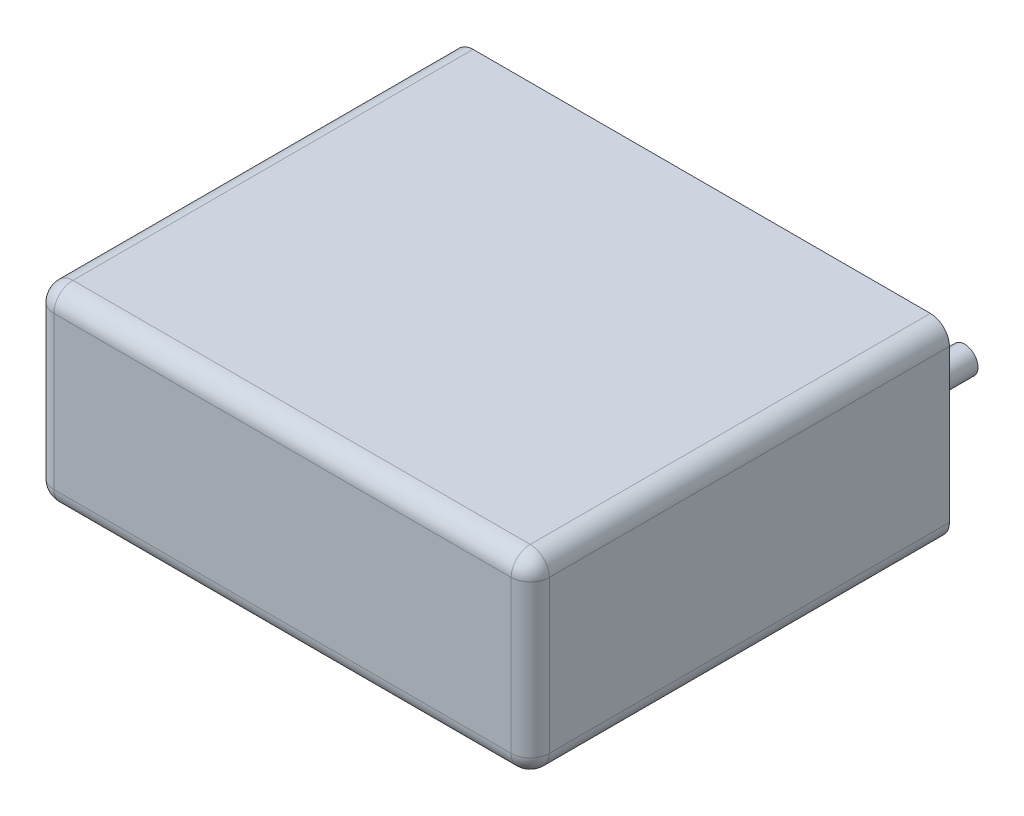
ISO-10303-21;
HEADER;
FILE_DESCRIPTION(('STEP AP214'),'2;1');
FILE_NAME('part.step','',(''),(''),'','','');
FILE_SCHEMA(('AUTOMOTIVE_DESIGN { 1 0 10303 214 1 1 1 1 }'));
ENDSEC;
DATA;
#1=APPLICATION_CONTEXT('core data for automotive mechanical design processes');
#2=APPLICATION_PROTOCOL_DEFINITION('international standard','automotive_design',2000,#1);
#3=PRODUCT_CONTEXT('',#1,'mechanical');
#4=PRODUCT('Part','Part','',(#3));
#5=PRODUCT_RELATED_PRODUCT_CATEGORY('part','',(#4));
#6=PRODUCT_DEFINITION_FORMATION('','',#4);
#7=PRODUCT_DEFINITION_CONTEXT('part definition',#1,'design');
#8=PRODUCT_DEFINITION('design','',#6,#7);
#9=PRODUCT_DEFINITION_SHAPE('','',#8);
#10=(LENGTH_UNIT() NAMED_UNIT(*) SI_UNIT(.MILLI.,.METRE.));
#11=(NAMED_UNIT(*) PLANE_ANGLE_UNIT() SI_UNIT($,.RADIAN.));
#12=(NAMED_UNIT(*) SI_UNIT($,.STERADIAN.) SOLID_ANGLE_UNIT());
#13=UNCERTAINTY_MEASURE_WITH_UNIT(LENGTH_MEASURE(1.E-05),#10,'distance_accuracy_value','');
#14=(GEOMETRIC_REPRESENTATION_CONTEXT(3) GLOBAL_UNCERTAINTY_ASSIGNED_CONTEXT((#13)) GLOBAL_UNIT_ASSIGNED_CONTEXT((#10,
#11,#12)) REPRESENTATION_CONTEXT('',''));
#15=CARTESIAN_POINT('',(0.,0.,0.));
#16=DIRECTION('',(0.,0.,1.));
#17=DIRECTION('',(1.,0.,0.));
#18=AXIS2_PLACEMENT_3D('',#15,#16,#17);
#19=CARTESIAN_POINT('',(11.,2.,10.5));
#20=DIRECTION('',(1.,0.,0.));
#21=DIRECTION('',(0.,0.,-1.));
#22=AXIS2_PLACEMENT_3D('',#19,#20,#21);
#23=SPHERICAL_SURFACE('',#22,0.5);
#24=CARTESIAN_POINT('',(11.,2.,10.5));
#25=DIRECTION('',(0.,0.,-1.));
#26=DIRECTION('',(-1.,0.,0.));
#27=AXIS2_PLACEMENT_3D('',#24,#25,#26);
#28=CIRCLE('',#27,0.5);
#29=CARTESIAN_POINT('',(11.,2.5,10.5));
#30=VERTEX_POINT('',#29);
#31=CARTESIAN_POINT('',(11.5,2.,10.5));
#32=VERTEX_POINT('',#31);
#33=EDGE_CURVE('E101',#30,#32,#28,.T.);
#34=ORIENTED_EDGE('',*,*,#33,.F.);
#35=CARTESIAN_POINT('',(11.,2.,10.5));
#36=DIRECTION('',(1.,0.,0.));
#37=DIRECTION('',(0.,0.,-1.));
#38=AXIS2_PLACEMENT_3D('',#35,#36,#37);
#39=CIRCLE('',#38,0.5);
#40=CARTESIAN_POINT('',(11.,2.,11.));
#41=VERTEX_POINT('',#40);
#42=EDGE_CURVE('E263',#41,#30,#39,.F.);
#43=ORIENTED_EDGE('',*,*,#42,.F.);
#44=CARTESIAN_POINT('',(11.,2.,10.5));
#45=DIRECTION('',(0.,1.,0.));
#46=DIRECTION('',(0.,0.,1.));
#47=AXIS2_PLACEMENT_3D('',#44,#45,#46);
#48=CIRCLE('',#47,0.5);
#49=EDGE_CURVE('E250',#32,#41,#48,.F.);
#50=ORIENTED_EDGE('',*,*,#49,.F.);
#51=EDGE_LOOP('',(#34,#43,#50));
#52=FACE_BOUND('',#51,.T.);
#53=ADVANCED_FACE('F17',(#52),#23,.T.);
#54=CARTESIAN_POINT('',(-1.,2.,10.5));
#55=DIRECTION('',(1.,0.,0.));
#56=DIRECTION('',(0.,0.,-1.));
#57=AXIS2_PLACEMENT_3D('',#54,#55,#56);
#58=SPHERICAL_SURFACE('',#57,0.5);
#59=CARTESIAN_POINT('',(-1.,2.,10.5));
#60=DIRECTION('',(1.,0.,0.));
#61=DIRECTION('',(0.,0.,-1.));
#62=AXIS2_PLACEMENT_3D('',#59,#60,#61);
#63=CIRCLE('',#62,0.5);
#64=CARTESIAN_POINT('',(-1.,2.5,10.5));
#65=VERTEX_POINT('',#64);
#66=CARTESIAN_POINT('',(-1.,2.,11.));
#67=VERTEX_POINT('',#66);
#68=EDGE_CURVE('E261',#65,#67,#63,.T.);
#69=ORIENTED_EDGE('',*,*,#68,.F.);
#70=CARTESIAN_POINT('',(-0.999999999999999,2.,10.5));
#71=DIRECTION('',(0.,0.,1.));
#72=DIRECTION('',(1.,0.,0.));
#73=AXIS2_PLACEMENT_3D('',#70,#71,#72);
#74=CIRCLE('',#73,0.5);
#75=CARTESIAN_POINT('',(-1.5,2.,10.5));
#76=VERTEX_POINT('',#75);
#77=EDGE_CURVE('E247',#76,#65,#74,.F.);
#78=ORIENTED_EDGE('',*,*,#77,.F.);
#79=CARTESIAN_POINT('',(-1.,2.,10.5));
#80=DIRECTION('',(0.,1.,0.));
#81=DIRECTION('',(0.,0.,1.));
#82=AXIS2_PLACEMENT_3D('',#79,#80,#81);
#83=CIRCLE('',#82,0.5);
#84=EDGE_CURVE('E246',#67,#76,#83,.F.);
#85=ORIENTED_EDGE('',*,*,#84,.F.);
#86=EDGE_LOOP('',(#69,#78,#85));
#87=FACE_BOUND('',#86,.T.);
#88=ADVANCED_FACE('F212',(#87),#58,.T.);
#89=CARTESIAN_POINT('',(0.35,0.,-1.9));
#90=DIRECTION('',(0.,0.,-1.));
#91=DIRECTION('',(-1.,0.,0.));
#92=AXIS2_PLACEMENT_3D('',#89,#90,#91);
#93=PLANE('',#92);
#94=CARTESIAN_POINT('',(0.,0.,-1.9));
#95=DIRECTION('',(0.,0.,1.));
#96=DIRECTION('',(1.,0.,0.));
#97=AXIS2_PLACEMENT_3D('',#94,#95,#96);
#98=CIRCLE('',#97,0.35);
#99=CARTESIAN_POINT('',(0.35,0.,-1.9));
#100=VERTEX_POINT('',#99);
#101=EDGE_CURVE('E244',#100,#100,#98,.T.);
#102=ORIENTED_EDGE('',*,*,#101,.F.);
#103=EDGE_LOOP('',(#102));
#104=FACE_BOUND('',#103,.T.);
#105=ADVANCED_FACE('F209',(#104),#93,.T.);
#106=CARTESIAN_POINT('',(10.35,0.,-1.9));
#107=DIRECTION('',(0.,0.,-1.));
#108=DIRECTION('',(-1.,0.,0.));
#109=AXIS2_PLACEMENT_3D('',#106,#107,#108);
#110=PLANE('',#109);
#111=CARTESIAN_POINT('',(10.,0.,-1.9));
#112=DIRECTION('',(0.,0.,1.));
#113=DIRECTION('',(1.,0.,0.));
#114=AXIS2_PLACEMENT_3D('',#111,#112,#113);
#115=CIRCLE('',#114,0.35);
#116=CARTESIAN_POINT('',(10.35,0.,-1.9));
#117=VERTEX_POINT('',#116);
#118=EDGE_CURVE('E240',#117,#117,#115,.T.);
#119=ORIENTED_EDGE('',*,*,#118,.F.);
#120=EDGE_LOOP('',(#119));
#121=FACE_BOUND('',#120,.T.);
#122=ADVANCED_FACE('F206',(#121),#110,.T.);
#123=CARTESIAN_POINT('',(11.,2.,0.));
#124=DIRECTION('',(0.,0.,-1.));
#125=DIRECTION('',(-1.,0.,0.));
#126=AXIS2_PLACEMENT_3D('',#123,#124,#125);
#127=CYLINDRICAL_SURFACE('',#126,0.5);
#128=ORIENTED_EDGE('',*,*,#33,.T.);
#129=DIRECTION('',(0.,0.,-1.));
#130=VECTOR('',#129,1.);
#131=CARTESIAN_POINT('',(11.5,2.,11.));
#132=LINE('',#131,#130);
#133=CARTESIAN_POINT('',(11.5,2.,0.));
#134=VERTEX_POINT('',#133);
#135=EDGE_CURVE('E99',#134,#32,#132,.F.);
#136=ORIENTED_EDGE('',*,*,#135,.F.);
#137=CARTESIAN_POINT('',(11.,2.,0.));
#138=DIRECTION('',(0.,0.,-1.));
#139=DIRECTION('',(-1.,0.,0.));
#140=AXIS2_PLACEMENT_3D('',#137,#138,#139);
#141=CIRCLE('',#140,0.5);
#142=CARTESIAN_POINT('',(11.,2.5,0.));
#143=VERTEX_POINT('',#142);
#144=EDGE_CURVE('E21',#134,#143,#141,.F.);
#145=ORIENTED_EDGE('',*,*,#144,.T.);
#146=DIRECTION('',(0.,0.,1.));
#147=VECTOR('',#146,1.);
#148=CARTESIAN_POINT('',(11.,2.5,0.));
#149=LINE('',#148,#147);
#150=EDGE_CURVE('E97',#30,#143,#149,.F.);
#151=ORIENTED_EDGE('',*,*,#150,.F.);
#152=EDGE_LOOP('',(#128,#136,#145,#151));
#153=FACE_BOUND('',#152,.T.);
#154=ADVANCED_FACE('F96',(#153),#127,.T.);
#155=CARTESIAN_POINT('',(-1.,2.,0.));
#156=DIRECTION('',(0.,0.,1.));
#157=DIRECTION('',(1.,0.,0.));
#158=AXIS2_PLACEMENT_3D('',#155,#156,#157);
#159=CYLINDRICAL_SURFACE('',#158,0.5);
#160=ORIENTED_EDGE('',*,*,#77,.T.);
#161=DIRECTION('',(0.,0.,1.));
#162=VECTOR('',#161,1.);
#163=CARTESIAN_POINT('',(-1.,2.5,0.));
#164=LINE('',#163,#162);
#165=CARTESIAN_POINT('',(-1.,2.5,0.));
#166=VERTEX_POINT('',#165);
#167=EDGE_CURVE('E243',#166,#65,#164,.T.);
#168=ORIENTED_EDGE('',*,*,#167,.F.);
#169=CARTESIAN_POINT('',(-1.,2.,0.));
#170=DIRECTION('',(0.,0.,1.));
#171=DIRECTION('',(1.,0.,0.));
#172=AXIS2_PLACEMENT_3D('',#169,#170,#171);
#173=CIRCLE('',#172,0.5);
#174=CARTESIAN_POINT('',(-1.5,2.,0.));
#175=VERTEX_POINT('',#174);
#176=EDGE_CURVE('E116',#166,#175,#173,.T.);
#177=ORIENTED_EDGE('',*,*,#176,.T.);
#178=DIRECTION('',(0.,0.,1.));
#179=VECTOR('',#178,1.);
#180=CARTESIAN_POINT('',(-1.5,2.,0.));
#181=LINE('',#180,#179);
#182=EDGE_CURVE('E285',#76,#175,#181,.F.);
#183=ORIENTED_EDGE('',*,*,#182,.F.);
#184=EDGE_LOOP('',(#160,#168,#177,#183));
#185=FACE_BOUND('',#184,.T.);
#186=ADVANCED_FACE('F199',(#185),#159,.T.);
#187=CARTESIAN_POINT('',(11.,-2.5,10.5));
#188=DIRECTION('',(0.,1.,0.));
#189=DIRECTION('',(0.,0.,1.));
#190=AXIS2_PLACEMENT_3D('',#187,#188,#189);
#191=CYLINDRICAL_SURFACE('',#190,0.5);
#192=ORIENTED_EDGE('',*,*,#49,.T.);
#193=DIRECTION('',(0.,1.,0.));
#194=VECTOR('',#193,1.);
#195=CARTESIAN_POINT('',(11.,-2.5,11.));
#196=LINE('',#195,#194);
#197=CARTESIAN_POINT('',(11.,-1.99999999999923,11.));
#198=VERTEX_POINT('',#197);
#199=EDGE_CURVE('E277',#198,#41,#196,.T.);
#200=ORIENTED_EDGE('',*,*,#199,.F.);
#201=CARTESIAN_POINT('',(11.,-2.,10.5));
#202=DIRECTION('',(0.,-1.,6.13299445270928E-12));
#203=DIRECTION('',(1.,0.,0.));
#204=AXIS2_PLACEMENT_3D('',#201,#202,#203);
#205=CIRCLE('',#204,0.5);
#206=CARTESIAN_POINT('',(11.5,-2.,10.5));
#207=VERTEX_POINT('',#206);
#208=EDGE_CURVE('E319',#207,#198,#205,.T.);
#209=ORIENTED_EDGE('',*,*,#208,.F.);
#210=DIRECTION('',(0.,1.,0.));
#211=VECTOR('',#210,1.);
#212=CARTESIAN_POINT('',(11.5,-2.5,10.5));
#213=LINE('',#212,#211);
#214=EDGE_CURVE('E286',#32,#207,#213,.F.);
#215=ORIENTED_EDGE('',*,*,#214,.F.);
#216=EDGE_LOOP('',(#192,#200,#209,#215));
#217=FACE_BOUND('',#216,.T.);
#218=ADVANCED_FACE('F195',(#217),#191,.T.);
#219=CARTESIAN_POINT('',(0.,2.,10.5));
#220=DIRECTION('',(1.,0.,0.));
#221=DIRECTION('',(0.,0.,-1.));
#222=AXIS2_PLACEMENT_3D('',#219,#220,#221);
#223=CYLINDRICAL_SURFACE('',#222,0.5);
#224=ORIENTED_EDGE('',*,*,#68,.T.);
#225=DIRECTION('',(1.,0.,0.));
#226=VECTOR('',#225,1.);
#227=CARTESIAN_POINT('',(-1.5,2.,11.));
#228=LINE('',#227,#226);
#229=EDGE_CURVE('E224',#41,#67,#228,.F.);
#230=ORIENTED_EDGE('',*,*,#229,.F.);
#231=ORIENTED_EDGE('',*,*,#42,.T.);
#232=DIRECTION('',(1.,0.,0.));
#233=VECTOR('',#232,1.);
#234=CARTESIAN_POINT('',(0.,2.5,10.5));
#235=LINE('',#234,#233);
#236=EDGE_CURVE('E109',#65,#30,#235,.T.);
#237=ORIENTED_EDGE('',*,*,#236,.F.);
#238=EDGE_LOOP('',(#224,#230,#231,#237));
#239=FACE_BOUND('',#238,.T.);
#240=ADVANCED_FACE('F191',(#239),#223,.T.);
#241=CARTESIAN_POINT('',(-1.,-2.5,10.5));
#242=DIRECTION('',(0.,1.,0.));
#243=DIRECTION('',(0.,0.,1.));
#244=AXIS2_PLACEMENT_3D('',#241,#242,#243);
#245=CYLINDRICAL_SURFACE('',#244,0.5);
#246=ORIENTED_EDGE('',*,*,#84,.T.);
#247=DIRECTION('',(0.,1.,0.));
#248=VECTOR('',#247,1.);
#249=CARTESIAN_POINT('',(-1.5,-2.5,10.5));
#250=LINE('',#249,#248);
#251=CARTESIAN_POINT('',(-1.5,-2.,10.5));
#252=VERTEX_POINT('',#251);
#253=EDGE_CURVE('E282',#252,#76,#250,.T.);
#254=ORIENTED_EDGE('',*,*,#253,.F.);
#255=CARTESIAN_POINT('',(-1.,-2.,10.5));
#256=DIRECTION('',(0.,1.,0.));
#257=DIRECTION('',(0.,0.,1.));
#258=AXIS2_PLACEMENT_3D('',#255,#256,#257);
#259=CIRCLE('',#258,0.5);
#260=CARTESIAN_POINT('',(-1.,-2.,11.));
#261=VERTEX_POINT('',#260);
#262=EDGE_CURVE('E262',#252,#261,#259,.T.);
#263=ORIENTED_EDGE('',*,*,#262,.T.);
#264=DIRECTION('',(0.,1.,0.));
#265=VECTOR('',#264,1.);
#266=CARTESIAN_POINT('',(-1.,-2.5,11.));
#267=LINE('',#266,#265);
#268=EDGE_CURVE('E138',#67,#261,#267,.F.);
#269=ORIENTED_EDGE('',*,*,#268,.F.);
#270=EDGE_LOOP('',(#246,#254,#263,#269));
#271=FACE_BOUND('',#270,.T.);
#272=ADVANCED_FACE('F187',(#271),#245,.T.);
#273=CARTESIAN_POINT('',(0.,0.,-1.9));
#274=DIRECTION('',(0.,0.,1.));
#275=DIRECTION('',(1.,0.,0.));
#276=AXIS2_PLACEMENT_3D('',#273,#274,#275);
#277=CYLINDRICAL_SURFACE('',#276,0.35);
#278=CARTESIAN_POINT('',(0.,0.,0.));
#279=DIRECTION('',(0.,0.,1.));
#280=DIRECTION('',(1.,0.,0.));
#281=AXIS2_PLACEMENT_3D('',#278,#279,#280);
#282=CIRCLE('',#281,0.35);
#283=CARTESIAN_POINT('',(0.35,0.,0.));
#284=VERTEX_POINT('',#283);
#285=EDGE_CURVE('E237',#284,#284,#282,.T.);
#286=ORIENTED_EDGE('',*,*,#285,.F.);
#287=EDGE_LOOP('',(#286));
#288=FACE_BOUND('',#287,.T.);
#289=ORIENTED_EDGE('',*,*,#101,.T.);
#290=EDGE_LOOP('',(#289));
#291=FACE_BOUND('',#290,.T.);
#292=ADVANCED_FACE('F183',(#288,#291),#277,.T.);
#293=CARTESIAN_POINT('',(10.,0.,-1.9));
#294=DIRECTION('',(0.,0.,1.));
#295=DIRECTION('',(1.,0.,0.));
#296=AXIS2_PLACEMENT_3D('',#293,#294,#295);
#297=CYLINDRICAL_SURFACE('',#296,0.35);
#298=CARTESIAN_POINT('',(10.,0.,0.));
#299=DIRECTION('',(0.,0.,1.));
#300=DIRECTION('',(1.,0.,0.));
#301=AXIS2_PLACEMENT_3D('',#298,#299,#300);
#302=CIRCLE('',#301,0.35);
#303=CARTESIAN_POINT('',(10.35,0.,0.));
#304=VERTEX_POINT('',#303);
#305=EDGE_CURVE('E123',#304,#304,#302,.T.);
#306=ORIENTED_EDGE('',*,*,#305,.F.);
#307=EDGE_LOOP('',(#306));
#308=FACE_BOUND('',#307,.T.);
#309=ORIENTED_EDGE('',*,*,#118,.T.);
#310=EDGE_LOOP('',(#309));
#311=FACE_BOUND('',#310,.T.);
#312=ADVANCED_FACE('F180',(#308,#311),#297,.T.);
#313=CARTESIAN_POINT('',(0.,2.5,0.));
#314=DIRECTION('',(0.,1.,0.));
#315=DIRECTION('',(0.,0.,1.));
#316=AXIS2_PLACEMENT_3D('',#313,#314,#315);
#317=PLANE('',#316);
#318=ORIENTED_EDGE('',*,*,#236,.T.);
#319=ORIENTED_EDGE('',*,*,#150,.T.);
#320=DIRECTION('',(-1.,0.,0.));
#321=VECTOR('',#320,1.);
#322=CARTESIAN_POINT('',(11.5,2.5,0.));
#323=LINE('',#322,#321);
#324=EDGE_CURVE('E107',#166,#143,#323,.F.);
#325=ORIENTED_EDGE('',*,*,#324,.F.);
#326=ORIENTED_EDGE('',*,*,#167,.T.);
#327=EDGE_LOOP('',(#318,#319,#325,#326));
#328=FACE_BOUND('',#327,.T.);
#329=ADVANCED_FACE('F105',(#328),#317,.T.);
#330=CARTESIAN_POINT('',(11.5,-2.5,11.));
#331=DIRECTION('',(1.,0.,0.));
#332=DIRECTION('',(0.,0.,-1.));
#333=AXIS2_PLACEMENT_3D('',#330,#331,#332);
#334=PLANE('',#333);
#335=ORIENTED_EDGE('',*,*,#214,.T.);
#336=DIRECTION('',(0.,0.,1.));
#337=VECTOR('',#336,1.);
#338=CARTESIAN_POINT('',(11.5,-2.,11.));
#339=LINE('',#338,#337);
#340=CARTESIAN_POINT('',(11.5,-2.,0.));
#341=VERTEX_POINT('',#340);
#342=EDGE_CURVE('E137',#341,#207,#339,.T.);
#343=ORIENTED_EDGE('',*,*,#342,.F.);
#344=DIRECTION('',(0.,1.,0.));
#345=VECTOR('',#344,1.);
#346=CARTESIAN_POINT('',(11.5,-2.5,0.));
#347=LINE('',#346,#345);
#348=EDGE_CURVE('E118',#134,#341,#347,.F.);
#349=ORIENTED_EDGE('',*,*,#348,.F.);
#350=ORIENTED_EDGE('',*,*,#135,.T.);
#351=EDGE_LOOP('',(#335,#343,#349,#350));
#352=FACE_BOUND('',#351,.T.);
#353=ADVANCED_FACE('F173',(#352),#334,.T.);
#354=CARTESIAN_POINT('',(-1.5,-2.5,0.));
#355=DIRECTION('',(-1.,0.,0.));
#356=DIRECTION('',(0.,0.,1.));
#357=AXIS2_PLACEMENT_3D('',#354,#355,#356);
#358=PLANE('',#357);
#359=DIRECTION('',(0.,1.,0.));
#360=VECTOR('',#359,1.);
#361=CARTESIAN_POINT('',(-1.5,-2.5,0.));
#362=LINE('',#361,#360);
#363=CARTESIAN_POINT('',(-1.5,-2.,0.));
#364=VERTEX_POINT('',#363);
#365=EDGE_CURVE('E119',#364,#175,#362,.T.);
#366=ORIENTED_EDGE('',*,*,#365,.F.);
#367=DIRECTION('',(0.,0.,-1.));
#368=VECTOR('',#367,1.);
#369=CARTESIAN_POINT('',(-1.5,-2.,0.));
#370=LINE('',#369,#368);
#371=EDGE_CURVE('E145',#252,#364,#370,.T.);
#372=ORIENTED_EDGE('',*,*,#371,.F.);
#373=ORIENTED_EDGE('',*,*,#253,.T.);
#374=ORIENTED_EDGE('',*,*,#182,.T.);
#375=EDGE_LOOP('',(#366,#372,#373,#374));
#376=FACE_BOUND('',#375,.T.);
#377=ADVANCED_FACE('F169',(#376),#358,.T.);
#378=CARTESIAN_POINT('',(11.,-2.,10.5));
#379=DIRECTION('',(1.,0.,0.));
#380=DIRECTION('',(0.,0.,-1.));
#381=AXIS2_PLACEMENT_3D('',#378,#379,#380);
#382=SPHERICAL_SURFACE('',#381,0.5);
#383=CARTESIAN_POINT('',(11.,-2.,10.5));
#384=DIRECTION('',(0.,0.,1.));
#385=DIRECTION('',(1.,0.,0.));
#386=AXIS2_PLACEMENT_3D('',#383,#384,#385);
#387=CIRCLE('',#386,0.5);
#388=CARTESIAN_POINT('',(11.,-2.5,10.5));
#389=VERTEX_POINT('',#388);
#390=EDGE_CURVE('E135',#207,#389,#387,.F.);
#391=ORIENTED_EDGE('',*,*,#390,.F.);
#392=ORIENTED_EDGE('',*,*,#208,.T.);
#393=CARTESIAN_POINT('',(11.,-2.,10.5));
#394=DIRECTION('',(-1.,0.,0.));
#395=DIRECTION('',(0.,0.,1.));
#396=AXIS2_PLACEMENT_3D('',#393,#394,#395);
#397=CIRCLE('',#396,0.5);
#398=EDGE_CURVE('E141',#389,#198,#397,.T.);
#399=ORIENTED_EDGE('',*,*,#398,.F.);
#400=EDGE_LOOP('',(#391,#392,#399));
#401=FACE_BOUND('',#400,.T.);
#402=ADVANCED_FACE('F165',(#401),#382,.T.);
#403=CARTESIAN_POINT('',(-1.5,-2.5,11.));
#404=DIRECTION('',(0.,0.,1.));
#405=DIRECTION('',(1.,0.,0.));
#406=AXIS2_PLACEMENT_3D('',#403,#404,#405);
#407=PLANE('',#406);
#408=ORIENTED_EDGE('',*,*,#268,.T.);
#409=DIRECTION('',(-1.,0.,0.));
#410=VECTOR('',#409,1.);
#411=CARTESIAN_POINT('',(-1.5,-2.,11.));
#412=LINE('',#411,#410);
#413=EDGE_CURVE('E144',#198,#261,#412,.T.);
#414=ORIENTED_EDGE('',*,*,#413,.F.);
#415=ORIENTED_EDGE('',*,*,#199,.T.);
#416=ORIENTED_EDGE('',*,*,#229,.T.);
#417=EDGE_LOOP('',(#408,#414,#415,#416));
#418=FACE_BOUND('',#417,.T.);
#419=ADVANCED_FACE('F160',(#418),#407,.T.);
#420=CARTESIAN_POINT('',(-1.,-2.,10.5));
#421=DIRECTION('',(1.,0.,0.));
#422=DIRECTION('',(0.,0.,-1.));
#423=AXIS2_PLACEMENT_3D('',#420,#421,#422);
#424=SPHERICAL_SURFACE('',#423,0.5);
#425=CARTESIAN_POINT('',(-1.,-2.,10.5));
#426=DIRECTION('',(-1.,0.,0.));
#427=DIRECTION('',(0.,0.,1.));
#428=AXIS2_PLACEMENT_3D('',#425,#426,#427);
#429=CIRCLE('',#428,0.5);
#430=CARTESIAN_POINT('',(-1.,-2.5,10.4999999999939));
#431=VERTEX_POINT('',#430);
#432=EDGE_CURVE('E35',#261,#431,#429,.F.);
#433=ORIENTED_EDGE('',*,*,#432,.F.);
#434=ORIENTED_EDGE('',*,*,#262,.F.);
#435=CARTESIAN_POINT('',(-0.999999999999999,-2.,10.5));
#436=DIRECTION('',(0.,0.,-1.));
#437=DIRECTION('',(-1.,0.,0.));
#438=AXIS2_PLACEMENT_3D('',#435,#436,#437);
#439=CIRCLE('',#438,0.5);
#440=EDGE_CURVE('E233',#431,#252,#439,.T.);
#441=ORIENTED_EDGE('',*,*,#440,.F.);
#442=EDGE_LOOP('',(#433,#434,#441));
#443=FACE_BOUND('',#442,.T.);
#444=ADVANCED_FACE('F155',(#443),#424,.T.);
#445=CARTESIAN_POINT('',(11.,-2.,11.));
#446=DIRECTION('',(0.,0.,1.));
#447=DIRECTION('',(1.,0.,0.));
#448=AXIS2_PLACEMENT_3D('',#445,#446,#447);
#449=CYLINDRICAL_SURFACE('',#448,0.5);
#450=CARTESIAN_POINT('',(11.,-2.,0.));
#451=DIRECTION('',(0.,0.,1.));
#452=DIRECTION('',(1.,0.,0.));
#453=AXIS2_PLACEMENT_3D('',#450,#451,#452);
#454=CIRCLE('',#453,0.5);
#455=CARTESIAN_POINT('',(11.,-2.5,0.));
#456=VERTEX_POINT('',#455);
#457=EDGE_CURVE('E121',#341,#456,#454,.F.);
#458=ORIENTED_EDGE('',*,*,#457,.F.);
#459=ORIENTED_EDGE('',*,*,#342,.T.);
#460=ORIENTED_EDGE('',*,*,#390,.T.);
#461=DIRECTION('',(0.,0.,1.));
#462=VECTOR('',#461,1.);
#463=CARTESIAN_POINT('',(11.,-2.5,0.));
#464=LINE('',#463,#462);
#465=EDGE_CURVE('E126',#389,#456,#464,.F.);
#466=ORIENTED_EDGE('',*,*,#465,.T.);
#467=EDGE_LOOP('',(#458,#459,#460,#466));
#468=FACE_BOUND('',#467,.T.);
#469=ADVANCED_FACE('F159',(#468),#449,.T.);
#470=CARTESIAN_POINT('',(11.5,-2.5,0.));
#471=DIRECTION('',(0.,0.,-1.));
#472=DIRECTION('',(-1.,0.,0.));
#473=AXIS2_PLACEMENT_3D('',#470,#471,#472);
#474=PLANE('',#473);
#475=DIRECTION('',(1.,0.,0.));
#476=VECTOR('',#475,1.);
#477=CARTESIAN_POINT('',(0.,-2.5,0.));
#478=LINE('',#477,#476);
#479=CARTESIAN_POINT('',(-1.,-2.5,0.));
#480=VERTEX_POINT('',#479);
#481=EDGE_CURVE('E129',#456,#480,#478,.F.);
#482=ORIENTED_EDGE('',*,*,#481,.T.);
#483=CARTESIAN_POINT('',(-1.,-2.,0.));
#484=DIRECTION('',(0.,0.,-1.));
#485=DIRECTION('',(-1.,0.,0.));
#486=AXIS2_PLACEMENT_3D('',#483,#484,#485);
#487=CIRCLE('',#486,0.5);
#488=EDGE_CURVE('E231',#364,#480,#487,.F.);
#489=ORIENTED_EDGE('',*,*,#488,.F.);
#490=ORIENTED_EDGE('',*,*,#365,.T.);
#491=ORIENTED_EDGE('',*,*,#176,.F.);
#492=ORIENTED_EDGE('',*,*,#324,.T.);
#493=ORIENTED_EDGE('',*,*,#144,.F.);
#494=ORIENTED_EDGE('',*,*,#348,.T.);
#495=ORIENTED_EDGE('',*,*,#457,.T.);
#496=EDGE_LOOP('',(#482,#489,#490,#491,#492,#493,#494,#495));
#497=FACE_BOUND('',#496,.T.);
#498=ORIENTED_EDGE('',*,*,#305,.T.);
#499=EDGE_LOOP('',(#498));
#500=FACE_BOUND('',#499,.T.);
#501=ORIENTED_EDGE('',*,*,#285,.T.);
#502=EDGE_LOOP('',(#501));
#503=FACE_BOUND('',#502,.T.);
#504=ADVANCED_FACE('F113',(#497,#500,#503),#474,.T.);
#505=CARTESIAN_POINT('',(-1.,-2.,0.));
#506=DIRECTION('',(0.,0.,-1.));
#507=DIRECTION('',(-1.,0.,0.));
#508=AXIS2_PLACEMENT_3D('',#505,#506,#507);
#509=CYLINDRICAL_SURFACE('',#508,0.5);
#510=ORIENTED_EDGE('',*,*,#440,.T.);
#511=ORIENTED_EDGE('',*,*,#371,.T.);
#512=ORIENTED_EDGE('',*,*,#488,.T.);
#513=DIRECTION('',(0.,0.,1.));
#514=VECTOR('',#513,1.);
#515=CARTESIAN_POINT('',(-1.,-2.5,0.));
#516=LINE('',#515,#514);
#517=EDGE_CURVE('E27',#480,#431,#516,.T.);
#518=ORIENTED_EDGE('',*,*,#517,.T.);
#519=EDGE_LOOP('',(#510,#511,#512,#518));
#520=FACE_BOUND('',#519,.T.);
#521=ADVANCED_FACE('F342',(#520),#509,.T.);
#522=CARTESIAN_POINT('',(-1.5,-2.,10.5));
#523=DIRECTION('',(-1.,0.,0.));
#524=DIRECTION('',(0.,0.,1.));
#525=AXIS2_PLACEMENT_3D('',#522,#523,#524);
#526=CYLINDRICAL_SURFACE('',#525,0.5);
#527=ORIENTED_EDGE('',*,*,#432,.T.);
#528=DIRECTION('',(1.,0.,0.));
#529=VECTOR('',#528,1.);
#530=CARTESIAN_POINT('',(0.,-2.5,10.5));
#531=LINE('',#530,#529);
#532=EDGE_CURVE('E11',#431,#389,#531,.T.);
#533=ORIENTED_EDGE('',*,*,#532,.T.);
#534=ORIENTED_EDGE('',*,*,#398,.T.);
#535=ORIENTED_EDGE('',*,*,#413,.T.);
#536=EDGE_LOOP('',(#527,#533,#534,#535));
#537=FACE_BOUND('',#536,.T.);
#538=ADVANCED_FACE('F337',(#537),#526,.T.);
#539=CARTESIAN_POINT('',(0.,-2.5,0.));
#540=DIRECTION('',(0.,1.,0.));
#541=DIRECTION('',(0.,0.,1.));
#542=AXIS2_PLACEMENT_3D('',#539,#540,#541);
#543=PLANE('',#542);
#544=ORIENTED_EDGE('',*,*,#517,.F.);
#545=ORIENTED_EDGE('',*,*,#481,.F.);
#546=ORIENTED_EDGE('',*,*,#465,.F.);
#547=ORIENTED_EDGE('',*,*,#532,.F.);
#548=EDGE_LOOP('',(#544,#545,#546,#547));
#549=FACE_BOUND('',#548,.T.);
#550=ADVANCED_FACE('F340',(#549),#543,.F.);
#551=CLOSED_SHELL('',(#53,#88,#105,#122,#154,#186,#218,#240,#272,#292,#312,#329,#353,#377,#402,
#419,#444,#469,#504,#521,#538,#550));
#552=MANIFOLD_SOLID_BREP('B1',#551);
#553=ADVANCED_BREP_SHAPE_REPRESENTATION('',(#18,#552),#14);
#554=SHAPE_DEFINITION_REPRESENTATION(#9,#553);
ENDSEC;
END-ISO-10303-21;
